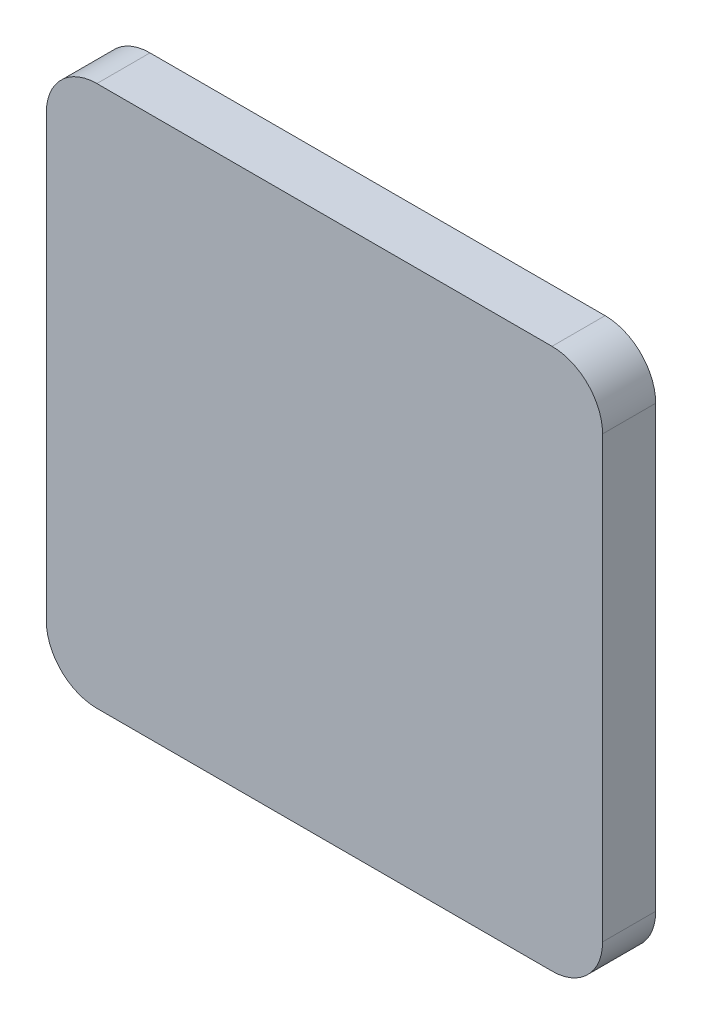
ISO-10303-21;
HEADER;
FILE_DESCRIPTION(('STEP AP214'),'2;1');
FILE_NAME('part.step','',(''),(''),'','','');
FILE_SCHEMA(('AUTOMOTIVE_DESIGN { 1 0 10303 214 1 1 1 1 }'));
ENDSEC;
DATA;
#1=APPLICATION_CONTEXT('core data for automotive mechanical design processes');
#2=APPLICATION_PROTOCOL_DEFINITION('international standard','automotive_design',2000,#1);
#3=PRODUCT_CONTEXT('',#1,'mechanical');
#4=PRODUCT('Part','Part','',(#3));
#5=PRODUCT_RELATED_PRODUCT_CATEGORY('part','',(#4));
#6=PRODUCT_DEFINITION_FORMATION('','',#4);
#7=PRODUCT_DEFINITION_CONTEXT('part definition',#1,'design');
#8=PRODUCT_DEFINITION('design','',#6,#7);
#9=PRODUCT_DEFINITION_SHAPE('','',#8);
#10=(LENGTH_UNIT() NAMED_UNIT(*) SI_UNIT(.MILLI.,.METRE.));
#11=(NAMED_UNIT(*) PLANE_ANGLE_UNIT() SI_UNIT($,.RADIAN.));
#12=(NAMED_UNIT(*) SI_UNIT($,.STERADIAN.) SOLID_ANGLE_UNIT());
#13=UNCERTAINTY_MEASURE_WITH_UNIT(LENGTH_MEASURE(1.E-05),#10,'distance_accuracy_value','');
#14=(GEOMETRIC_REPRESENTATION_CONTEXT(3) GLOBAL_UNCERTAINTY_ASSIGNED_CONTEXT((#13)) GLOBAL_UNIT_ASSIGNED_CONTEXT((#10,
#11,#12)) REPRESENTATION_CONTEXT('',''));
#15=CARTESIAN_POINT('',(0.,0.,0.));
#16=DIRECTION('',(0.,0.,1.));
#17=DIRECTION('',(1.,0.,0.));
#18=AXIS2_PLACEMENT_3D('',#15,#16,#17);
#19=CARTESIAN_POINT('',(8.5,2.5,-20.5854317418897));
#20=DIRECTION('',(0.,0.,-1.));
#21=DIRECTION('',(-1.,0.,0.));
#22=AXIS2_PLACEMENT_3D('',#19,#20,#21);
#23=CYLINDRICAL_SURFACE('',#22,0.5);
#24=DIRECTION('',(0.,0.,1.));
#25=VECTOR('',#24,1.);
#26=CARTESIAN_POINT('',(8.5,2.,2.));
#27=LINE('',#26,#25);
#28=CARTESIAN_POINT('',(8.5,2.,1.6));
#29=VERTEX_POINT('',#28);
#30=CARTESIAN_POINT('',(8.5,2.,0.));
#31=VERTEX_POINT('',#30);
#32=EDGE_CURVE('E344',#29,#31,#27,.F.);
#33=ORIENTED_EDGE('',*,*,#32,.F.);
#34=CARTESIAN_POINT('',(8.5,2.5,1.6));
#35=DIRECTION('',(0.,0.,-1.));
#36=DIRECTION('',(-1.,0.,0.));
#37=AXIS2_PLACEMENT_3D('',#34,#35,#36);
#38=CIRCLE('',#37,0.5);
#39=CARTESIAN_POINT('',(9.,2.5,1.6));
#40=VERTEX_POINT('',#39);
#41=EDGE_CURVE('E238',#40,#29,#38,.T.);
#42=ORIENTED_EDGE('',*,*,#41,.F.);
#43=DIRECTION('',(0.,0.,1.));
#44=VECTOR('',#43,1.);
#45=CARTESIAN_POINT('',(9.,2.5,-20.5854317418897));
#46=LINE('',#45,#44);
#47=CARTESIAN_POINT('',(9.,2.5,0.));
#48=VERTEX_POINT('',#47);
#49=EDGE_CURVE('E237',#48,#40,#46,.T.);
#50=ORIENTED_EDGE('',*,*,#49,.F.);
#51=CARTESIAN_POINT('',(8.5,2.5,0.));
#52=DIRECTION('',(0.,0.,-1.));
#53=DIRECTION('',(-1.,0.,0.));
#54=AXIS2_PLACEMENT_3D('',#51,#52,#53);
#55=CIRCLE('',#54,0.5);
#56=EDGE_CURVE('E19',#31,#48,#55,.F.);
#57=ORIENTED_EDGE('',*,*,#56,.F.);
#58=EDGE_LOOP('',(#33,#42,#50,#57));
#59=FACE_BOUND('',#58,.T.);
#60=ADVANCED_FACE('F16',(#59),#23,.F.);
#61=CARTESIAN_POINT('',(8.5,18.9,2.));
#62=DIRECTION('',(0.,0.,-1.));
#63=DIRECTION('',(-1.,0.,0.));
#64=AXIS2_PLACEMENT_3D('',#61,#62,#63);
#65=CYLINDRICAL_SURFACE('',#64,0.5);
#66=DIRECTION('',(0.,0.,1.));
#67=VECTOR('',#66,1.);
#68=CARTESIAN_POINT('',(9.,18.9,-20.5854317418897));
#69=LINE('',#68,#67);
#70=CARTESIAN_POINT('',(9.,18.9,1.6));
#71=VERTEX_POINT('',#70);
#72=CARTESIAN_POINT('',(9.,18.9,0.));
#73=VERTEX_POINT('',#72);
#74=EDGE_CURVE('E249',#71,#73,#69,.F.);
#75=ORIENTED_EDGE('',*,*,#74,.F.);
#76=CARTESIAN_POINT('',(8.5,18.9,1.6));
#77=DIRECTION('',(0.,0.,-1.));
#78=DIRECTION('',(-1.,0.,0.));
#79=AXIS2_PLACEMENT_3D('',#76,#77,#78);
#80=CIRCLE('',#79,0.5);
#81=CARTESIAN_POINT('',(8.5,19.4,1.6));
#82=VERTEX_POINT('',#81);
#83=EDGE_CURVE('E439',#82,#71,#80,.T.);
#84=ORIENTED_EDGE('',*,*,#83,.F.);
#85=DIRECTION('',(0.,0.,-1.));
#86=VECTOR('',#85,1.);
#87=CARTESIAN_POINT('',(8.5,19.4,2.));
#88=LINE('',#87,#86);
#89=CARTESIAN_POINT('',(8.5,19.4,0.));
#90=VERTEX_POINT('',#89);
#91=EDGE_CURVE('E331',#90,#82,#88,.F.);
#92=ORIENTED_EDGE('',*,*,#91,.F.);
#93=CARTESIAN_POINT('',(8.5,18.9,0.));
#94=DIRECTION('',(0.,0.,-1.));
#95=DIRECTION('',(-1.,0.,0.));
#96=AXIS2_PLACEMENT_3D('',#93,#94,#95);
#97=CIRCLE('',#96,0.5);
#98=EDGE_CURVE('E235',#73,#90,#97,.F.);
#99=ORIENTED_EDGE('',*,*,#98,.F.);
#100=EDGE_LOOP('',(#75,#84,#92,#99));
#101=FACE_BOUND('',#100,.T.);
#102=ADVANCED_FACE('F446',(#101),#65,.F.);
#103=CARTESIAN_POINT('',(19.5,18.9,1.6));
#104=DIRECTION('',(0.,0.,-1.));
#105=DIRECTION('',(-1.,0.,0.));
#106=AXIS2_PLACEMENT_3D('',#103,#104,#105);
#107=PLANE('',#106);
#108=DIRECTION('',(1.,0.,0.));
#109=VECTOR('',#108,1.);
#110=CARTESIAN_POINT('',(2.,19.4,1.6));
#111=LINE('',#110,#109);
#112=CARTESIAN_POINT('',(2.5,19.4,1.6));
#113=VERTEX_POINT('',#112);
#114=EDGE_CURVE('E335',#82,#113,#111,.F.);
#115=ORIENTED_EDGE('',*,*,#114,.F.);
#116=ORIENTED_EDGE('',*,*,#83,.T.);
#117=DIRECTION('',(0.,-1.,0.));
#118=VECTOR('',#117,1.);
#119=CARTESIAN_POINT('',(9.,0.,1.6));
#120=LINE('',#119,#118);
#121=EDGE_CURVE('E243',#40,#71,#120,.F.);
#122=ORIENTED_EDGE('',*,*,#121,.F.);
#123=ORIENTED_EDGE('',*,*,#41,.T.);
#124=DIRECTION('',(1.,0.,0.));
#125=VECTOR('',#124,1.);
#126=CARTESIAN_POINT('',(2.,2.,1.6));
#127=LINE('',#126,#125);
#128=CARTESIAN_POINT('',(2.5,2.,1.6));
#129=VERTEX_POINT('',#128);
#130=EDGE_CURVE('E347',#129,#29,#127,.T.);
#131=ORIENTED_EDGE('',*,*,#130,.F.);
#132=CARTESIAN_POINT('',(2.5,2.5,1.6));
#133=DIRECTION('',(0.,0.,1.));
#134=DIRECTION('',(1.,0.,0.));
#135=AXIS2_PLACEMENT_3D('',#132,#133,#134);
#136=CIRCLE('',#135,0.5);
#137=CARTESIAN_POINT('',(2.,2.5,1.6));
#138=VERTEX_POINT('',#137);
#139=EDGE_CURVE('E433',#129,#138,#136,.F.);
#140=ORIENTED_EDGE('',*,*,#139,.T.);
#141=DIRECTION('',(0.,1.,0.));
#142=VECTOR('',#141,1.);
#143=CARTESIAN_POINT('',(2.,2.,1.6));
#144=LINE('',#143,#142);
#145=CARTESIAN_POINT('',(2.,18.9,1.6));
#146=VERTEX_POINT('',#145);
#147=EDGE_CURVE('E330',#146,#138,#144,.F.);
#148=ORIENTED_EDGE('',*,*,#147,.F.);
#149=CARTESIAN_POINT('',(2.5,18.9,1.6));
#150=DIRECTION('',(0.,0.,1.));
#151=DIRECTION('',(1.,0.,0.));
#152=AXIS2_PLACEMENT_3D('',#149,#150,#151);
#153=CIRCLE('',#152,0.5);
#154=EDGE_CURVE('E427',#146,#113,#153,.F.);
#155=ORIENTED_EDGE('',*,*,#154,.T.);
#156=EDGE_LOOP('',(#115,#116,#122,#123,#131,#140,#148,#155));
#157=FACE_BOUND('',#156,.T.);
#158=ADVANCED_FACE('F534',(#157),#107,.T.);
#159=CARTESIAN_POINT('',(2.5,2.5,2.));
#160=DIRECTION('',(0.,0.,1.));
#161=DIRECTION('',(1.,0.,0.));
#162=AXIS2_PLACEMENT_3D('',#159,#160,#161);
#163=CYLINDRICAL_SURFACE('',#162,0.5);
#164=ORIENTED_EDGE('',*,*,#139,.F.);
#165=DIRECTION('',(0.,0.,1.));
#166=VECTOR('',#165,1.);
#167=CARTESIAN_POINT('',(2.5,2.,2.));
#168=LINE('',#167,#166);
#169=CARTESIAN_POINT('',(2.5,2.,0.));
#170=VERTEX_POINT('',#169);
#171=EDGE_CURVE('E244',#170,#129,#168,.T.);
#172=ORIENTED_EDGE('',*,*,#171,.F.);
#173=CARTESIAN_POINT('',(2.5,2.5,0.));
#174=DIRECTION('',(0.,0.,1.));
#175=DIRECTION('',(1.,0.,0.));
#176=AXIS2_PLACEMENT_3D('',#173,#174,#175);
#177=CIRCLE('',#176,0.5);
#178=CARTESIAN_POINT('',(2.,2.5,0.));
#179=VERTEX_POINT('',#178);
#180=EDGE_CURVE('E436',#179,#170,#177,.T.);
#181=ORIENTED_EDGE('',*,*,#180,.F.);
#182=DIRECTION('',(0.,0.,-1.));
#183=VECTOR('',#182,1.);
#184=CARTESIAN_POINT('',(2.,2.5,2.));
#185=LINE('',#184,#183);
#186=EDGE_CURVE('E326',#138,#179,#185,.T.);
#187=ORIENTED_EDGE('',*,*,#186,.F.);
#188=EDGE_LOOP('',(#164,#172,#181,#187));
#189=FACE_BOUND('',#188,.T.);
#190=ADVANCED_FACE('F747',(#189),#163,.F.);
#191=CARTESIAN_POINT('',(2.5,18.9,2.));
#192=DIRECTION('',(0.,0.,1.));
#193=DIRECTION('',(1.,0.,0.));
#194=AXIS2_PLACEMENT_3D('',#191,#192,#193);
#195=CYLINDRICAL_SURFACE('',#194,0.5);
#196=ORIENTED_EDGE('',*,*,#154,.F.);
#197=DIRECTION('',(0.,0.,-1.));
#198=VECTOR('',#197,1.);
#199=CARTESIAN_POINT('',(2.,18.9,2.));
#200=LINE('',#199,#198);
#201=CARTESIAN_POINT('',(2.,18.9,0.));
#202=VERTEX_POINT('',#201);
#203=EDGE_CURVE('E320',#202,#146,#200,.F.);
#204=ORIENTED_EDGE('',*,*,#203,.F.);
#205=CARTESIAN_POINT('',(2.5,18.9,0.));
#206=DIRECTION('',(0.,0.,1.));
#207=DIRECTION('',(1.,0.,0.));
#208=AXIS2_PLACEMENT_3D('',#205,#206,#207);
#209=CIRCLE('',#208,0.5);
#210=CARTESIAN_POINT('',(2.5,19.4,0.));
#211=VERTEX_POINT('',#210);
#212=EDGE_CURVE('E430',#211,#202,#209,.T.);
#213=ORIENTED_EDGE('',*,*,#212,.F.);
#214=DIRECTION('',(0.,0.,-1.));
#215=VECTOR('',#214,1.);
#216=CARTESIAN_POINT('',(2.5,19.4,2.));
#217=LINE('',#216,#215);
#218=EDGE_CURVE('E336',#113,#211,#217,.T.);
#219=ORIENTED_EDGE('',*,*,#218,.F.);
#220=EDGE_LOOP('',(#196,#204,#213,#219));
#221=FACE_BOUND('',#220,.T.);
#222=ADVANCED_FACE('F453',(#221),#195,.F.);
#223=CARTESIAN_POINT('',(19.5,4.5,2.));
#224=DIRECTION('',(0.,0.,1.));
#225=DIRECTION('',(1.,0.,0.));
#226=AXIS2_PLACEMENT_3D('',#223,#224,#225);
#227=CYLINDRICAL_SURFACE('',#226,0.5);
#228=DIRECTION('',(0.,0.,1.));
#229=VECTOR('',#228,1.);
#230=CARTESIAN_POINT('',(19.5,4.,-20.5854317418897));
#231=LINE('',#230,#229);
#232=CARTESIAN_POINT('',(19.5,4.,0.));
#233=VERTEX_POINT('',#232);
#234=CARTESIAN_POINT('',(19.5,4.,1.6));
#235=VERTEX_POINT('',#234);
#236=EDGE_CURVE('E319',#233,#235,#231,.T.);
#237=ORIENTED_EDGE('',*,*,#236,.T.);
#238=CARTESIAN_POINT('',(19.5,4.5,1.6));
#239=DIRECTION('',(0.,0.,1.));
#240=DIRECTION('',(1.,0.,0.));
#241=AXIS2_PLACEMENT_3D('',#238,#239,#240);
#242=CIRCLE('',#241,0.5);
#243=CARTESIAN_POINT('',(20.,4.5,1.6));
#244=VERTEX_POINT('',#243);
#245=EDGE_CURVE('E411',#244,#235,#242,.F.);
#246=ORIENTED_EDGE('',*,*,#245,.F.);
#247=DIRECTION('',(0.,0.,1.));
#248=VECTOR('',#247,1.);
#249=CARTESIAN_POINT('',(20.,4.5,2.));
#250=LINE('',#249,#248);
#251=CARTESIAN_POINT('',(20.,4.5,0.));
#252=VERTEX_POINT('',#251);
#253=EDGE_CURVE('E305',#252,#244,#250,.T.);
#254=ORIENTED_EDGE('',*,*,#253,.F.);
#255=CARTESIAN_POINT('',(19.5,4.5,0.));
#256=DIRECTION('',(0.,0.,1.));
#257=DIRECTION('',(1.,0.,0.));
#258=AXIS2_PLACEMENT_3D('',#255,#256,#257);
#259=CIRCLE('',#258,0.5);
#260=EDGE_CURVE('E424',#233,#252,#259,.T.);
#261=ORIENTED_EDGE('',*,*,#260,.F.);
#262=EDGE_LOOP('',(#237,#246,#254,#261));
#263=FACE_BOUND('',#262,.T.);
#264=ADVANCED_FACE('F730',(#263),#227,.F.);
#265=CARTESIAN_POINT('',(19.5,16.9,-20.5854317418897));
#266=DIRECTION('',(0.,0.,-1.));
#267=DIRECTION('',(-1.,0.,0.));
#268=AXIS2_PLACEMENT_3D('',#265,#266,#267);
#269=CYLINDRICAL_SURFACE('',#268,0.5);
#270=DIRECTION('',(0.,0.,1.));
#271=VECTOR('',#270,1.);
#272=CARTESIAN_POINT('',(20.,16.9,2.));
#273=LINE('',#272,#271);
#274=CARTESIAN_POINT('',(20.,16.9,1.6));
#275=VERTEX_POINT('',#274);
#276=CARTESIAN_POINT('',(20.,16.9,0.));
#277=VERTEX_POINT('',#276);
#278=EDGE_CURVE('E311',#275,#277,#273,.F.);
#279=ORIENTED_EDGE('',*,*,#278,.F.);
#280=CARTESIAN_POINT('',(19.5,16.9,1.6));
#281=DIRECTION('',(0.,0.,-1.));
#282=DIRECTION('',(-1.,0.,0.));
#283=AXIS2_PLACEMENT_3D('',#280,#281,#282);
#284=CIRCLE('',#283,0.5);
#285=CARTESIAN_POINT('',(19.5,17.4,1.6));
#286=VERTEX_POINT('',#285);
#287=EDGE_CURVE('E371',#286,#275,#284,.T.);
#288=ORIENTED_EDGE('',*,*,#287,.F.);
#289=DIRECTION('',(0.,0.,-1.));
#290=VECTOR('',#289,1.);
#291=CARTESIAN_POINT('',(19.5,17.4,-20.5854317418897));
#292=LINE('',#291,#290);
#293=CARTESIAN_POINT('',(19.5,17.4,0.));
#294=VERTEX_POINT('',#293);
#295=EDGE_CURVE('E294',#294,#286,#292,.F.);
#296=ORIENTED_EDGE('',*,*,#295,.F.);
#297=CARTESIAN_POINT('',(19.5,16.9,0.));
#298=DIRECTION('',(0.,0.,-1.));
#299=DIRECTION('',(-1.,0.,0.));
#300=AXIS2_PLACEMENT_3D('',#297,#298,#299);
#301=CIRCLE('',#300,0.5);
#302=EDGE_CURVE('E421',#277,#294,#301,.F.);
#303=ORIENTED_EDGE('',*,*,#302,.F.);
#304=EDGE_LOOP('',(#279,#288,#296,#303));
#305=FACE_BOUND('',#304,.T.);
#306=ADVANCED_FACE('F721',(#305),#269,.F.);
#307=CARTESIAN_POINT('',(13.5,16.9,-20.5854317418897));
#308=DIRECTION('',(0.,0.,1.));
#309=DIRECTION('',(1.,0.,0.));
#310=AXIS2_PLACEMENT_3D('',#307,#308,#309);
#311=CYLINDRICAL_SURFACE('',#310,0.5);
#312=DIRECTION('',(0.,0.,-1.));
#313=VECTOR('',#312,1.);
#314=CARTESIAN_POINT('',(13.5,17.4,-20.5854317418897));
#315=LINE('',#314,#313);
#316=CARTESIAN_POINT('',(13.5,17.4,1.6));
#317=VERTEX_POINT('',#316);
#318=CARTESIAN_POINT('',(13.5,17.4,0.));
#319=VERTEX_POINT('',#318);
#320=EDGE_CURVE('E300',#317,#319,#315,.T.);
#321=ORIENTED_EDGE('',*,*,#320,.F.);
#322=CARTESIAN_POINT('',(13.5,16.9,1.6));
#323=DIRECTION('',(0.,0.,1.));
#324=DIRECTION('',(1.,0.,0.));
#325=AXIS2_PLACEMENT_3D('',#322,#323,#324);
#326=CIRCLE('',#325,0.5);
#327=CARTESIAN_POINT('',(13.,16.9,1.6));
#328=VERTEX_POINT('',#327);
#329=EDGE_CURVE('E404',#328,#317,#326,.F.);
#330=ORIENTED_EDGE('',*,*,#329,.F.);
#331=DIRECTION('',(0.,0.,1.));
#332=VECTOR('',#331,1.);
#333=CARTESIAN_POINT('',(13.,16.9,-20.5854317418897));
#334=LINE('',#333,#332);
#335=CARTESIAN_POINT('',(13.,16.9,0.));
#336=VERTEX_POINT('',#335);
#337=EDGE_CURVE('E289',#328,#336,#334,.F.);
#338=ORIENTED_EDGE('',*,*,#337,.T.);
#339=CARTESIAN_POINT('',(13.5,16.9,0.));
#340=DIRECTION('',(0.,0.,1.));
#341=DIRECTION('',(1.,0.,0.));
#342=AXIS2_PLACEMENT_3D('',#339,#340,#341);
#343=CIRCLE('',#342,0.5);
#344=EDGE_CURVE('E418',#319,#336,#343,.T.);
#345=ORIENTED_EDGE('',*,*,#344,.F.);
#346=EDGE_LOOP('',(#321,#330,#338,#345));
#347=FACE_BOUND('',#346,.T.);
#348=ADVANCED_FACE('F712',(#347),#311,.F.);
#349=CARTESIAN_POINT('',(13.5,4.5,-20.5854317418897));
#350=DIRECTION('',(0.,0.,-1.));
#351=DIRECTION('',(-1.,0.,0.));
#352=AXIS2_PLACEMENT_3D('',#349,#350,#351);
#353=CYLINDRICAL_SURFACE('',#352,0.5);
#354=DIRECTION('',(0.,0.,1.));
#355=VECTOR('',#354,1.);
#356=CARTESIAN_POINT('',(13.,4.5,-20.5854317418897));
#357=LINE('',#356,#355);
#358=CARTESIAN_POINT('',(13.,4.5,0.));
#359=VERTEX_POINT('',#358);
#360=CARTESIAN_POINT('',(13.,4.5,1.6));
#361=VERTEX_POINT('',#360);
#362=EDGE_CURVE('E293',#359,#361,#357,.T.);
#363=ORIENTED_EDGE('',*,*,#362,.T.);
#364=CARTESIAN_POINT('',(13.5,4.5,1.6));
#365=DIRECTION('',(0.,0.,-1.));
#366=DIRECTION('',(-1.,0.,0.));
#367=AXIS2_PLACEMENT_3D('',#364,#365,#366);
#368=CIRCLE('',#367,0.5);
#369=CARTESIAN_POINT('',(13.5,4.,1.6));
#370=VERTEX_POINT('',#369);
#371=EDGE_CURVE('E407',#370,#361,#368,.T.);
#372=ORIENTED_EDGE('',*,*,#371,.F.);
#373=DIRECTION('',(0.,0.,1.));
#374=VECTOR('',#373,1.);
#375=CARTESIAN_POINT('',(13.5,4.,-20.5854317418897));
#376=LINE('',#375,#374);
#377=CARTESIAN_POINT('',(13.5,4.,0.));
#378=VERTEX_POINT('',#377);
#379=EDGE_CURVE('E315',#370,#378,#376,.F.);
#380=ORIENTED_EDGE('',*,*,#379,.T.);
#381=CARTESIAN_POINT('',(13.5,4.5,0.));
#382=DIRECTION('',(0.,0.,-1.));
#383=DIRECTION('',(-1.,0.,0.));
#384=AXIS2_PLACEMENT_3D('',#381,#382,#383);
#385=CIRCLE('',#384,0.5);
#386=EDGE_CURVE('E415',#359,#378,#385,.F.);
#387=ORIENTED_EDGE('',*,*,#386,.F.);
#388=EDGE_LOOP('',(#363,#372,#380,#387));
#389=FACE_BOUND('',#388,.T.);
#390=ADVANCED_FACE('F552',(#389),#353,.F.);
#391=CARTESIAN_POINT('',(19.5,18.9,1.6));
#392=DIRECTION('',(0.,0.,-1.));
#393=DIRECTION('',(-1.,0.,0.));
#394=AXIS2_PLACEMENT_3D('',#391,#392,#393);
#395=PLANE('',#394);
#396=DIRECTION('',(1.,0.,0.));
#397=VECTOR('',#396,1.);
#398=CARTESIAN_POINT('',(0.,17.4,1.6));
#399=LINE('',#398,#397);
#400=EDGE_CURVE('E304',#286,#317,#399,.F.);
#401=ORIENTED_EDGE('',*,*,#400,.F.);
#402=ORIENTED_EDGE('',*,*,#287,.T.);
#403=DIRECTION('',(0.,1.,0.));
#404=VECTOR('',#403,1.);
#405=CARTESIAN_POINT('',(20.,2.,1.6));
#406=LINE('',#405,#404);
#407=EDGE_CURVE('E309',#244,#275,#406,.T.);
#408=ORIENTED_EDGE('',*,*,#407,.F.);
#409=ORIENTED_EDGE('',*,*,#245,.T.);
#410=DIRECTION('',(1.,0.,0.));
#411=VECTOR('',#410,1.);
#412=CARTESIAN_POINT('',(0.,4.,1.6));
#413=LINE('',#412,#411);
#414=EDGE_CURVE('E310',#235,#370,#413,.F.);
#415=ORIENTED_EDGE('',*,*,#414,.T.);
#416=ORIENTED_EDGE('',*,*,#371,.T.);
#417=DIRECTION('',(0.,-1.,0.));
#418=VECTOR('',#417,1.);
#419=CARTESIAN_POINT('',(13.,0.,1.6));
#420=LINE('',#419,#418);
#421=EDGE_CURVE('E261',#361,#328,#420,.F.);
#422=ORIENTED_EDGE('',*,*,#421,.T.);
#423=ORIENTED_EDGE('',*,*,#329,.T.);
#424=EDGE_LOOP('',(#401,#402,#408,#409,#415,#416,#422,#423));
#425=FACE_BOUND('',#424,.T.);
#426=ADVANCED_FACE('F548',(#425),#395,.T.);
#427=CARTESIAN_POINT('',(2.,2.,2.));
#428=DIRECTION('',(0.,1.,0.));
#429=DIRECTION('',(0.,0.,1.));
#430=AXIS2_PLACEMENT_3D('',#427,#428,#429);
#431=PLANE('',#430);
#432=DIRECTION('',(-1.,0.,0.));
#433=VECTOR('',#432,1.);
#434=CARTESIAN_POINT('',(20.,2.,0.));
#435=LINE('',#434,#433);
#436=EDGE_CURVE('E233',#170,#31,#435,.F.);
#437=ORIENTED_EDGE('',*,*,#436,.F.);
#438=ORIENTED_EDGE('',*,*,#171,.T.);
#439=ORIENTED_EDGE('',*,*,#130,.T.);
#440=ORIENTED_EDGE('',*,*,#32,.T.);
#441=EDGE_LOOP('',(#437,#438,#439,#440));
#442=FACE_BOUND('',#441,.T.);
#443=ADVANCED_FACE('F551',(#442),#431,.T.);
#444=CARTESIAN_POINT('',(9.,0.,-20.5854317418897));
#445=DIRECTION('',(-1.,0.,0.));
#446=DIRECTION('',(0.,-1.,0.));
#447=AXIS2_PLACEMENT_3D('',#444,#445,#446);
#448=PLANE('',#447);
#449=ORIENTED_EDGE('',*,*,#121,.T.);
#450=ORIENTED_EDGE('',*,*,#74,.T.);
#451=DIRECTION('',(0.,1.,0.));
#452=VECTOR('',#451,1.);
#453=CARTESIAN_POINT('',(9.,19.4,0.));
#454=LINE('',#453,#452);
#455=EDGE_CURVE('E231',#48,#73,#454,.T.);
#456=ORIENTED_EDGE('',*,*,#455,.F.);
#457=ORIENTED_EDGE('',*,*,#49,.T.);
#458=EDGE_LOOP('',(#449,#450,#456,#457));
#459=FACE_BOUND('',#458,.T.);
#460=ADVANCED_FACE('F247',(#459),#448,.T.);
#461=CARTESIAN_POINT('',(2.,19.4,2.));
#462=DIRECTION('',(0.,-1.,0.));
#463=DIRECTION('',(0.,0.,-1.));
#464=AXIS2_PLACEMENT_3D('',#461,#462,#463);
#465=PLANE('',#464);
#466=ORIENTED_EDGE('',*,*,#114,.T.);
#467=ORIENTED_EDGE('',*,*,#218,.T.);
#468=DIRECTION('',(-1.,0.,0.));
#469=VECTOR('',#468,1.);
#470=CARTESIAN_POINT('',(20.,19.4,0.));
#471=LINE('',#470,#469);
#472=EDGE_CURVE('E251',#90,#211,#471,.T.);
#473=ORIENTED_EDGE('',*,*,#472,.F.);
#474=ORIENTED_EDGE('',*,*,#91,.T.);
#475=EDGE_LOOP('',(#466,#467,#473,#474));
#476=FACE_BOUND('',#475,.T.);
#477=ADVANCED_FACE('F449',(#476),#465,.T.);
#478=CARTESIAN_POINT('',(2.,2.,2.));
#479=DIRECTION('',(1.,0.,0.));
#480=DIRECTION('',(0.,0.,-1.));
#481=AXIS2_PLACEMENT_3D('',#478,#479,#480);
#482=PLANE('',#481);
#483=DIRECTION('',(0.,1.,0.));
#484=VECTOR('',#483,1.);
#485=CARTESIAN_POINT('',(2.,19.4,0.));
#486=LINE('',#485,#484);
#487=EDGE_CURVE('E258',#202,#179,#486,.F.);
#488=ORIENTED_EDGE('',*,*,#487,.F.);
#489=ORIENTED_EDGE('',*,*,#203,.T.);
#490=ORIENTED_EDGE('',*,*,#147,.T.);
#491=ORIENTED_EDGE('',*,*,#186,.T.);
#492=EDGE_LOOP('',(#488,#489,#490,#491));
#493=FACE_BOUND('',#492,.T.);
#494=ADVANCED_FACE('F672',(#493),#482,.T.);
#495=CARTESIAN_POINT('',(0.,4.,-20.5854317418897));
#496=DIRECTION('',(0.,-1.,0.));
#497=DIRECTION('',(1.,0.,0.));
#498=AXIS2_PLACEMENT_3D('',#495,#496,#497);
#499=PLANE('',#498);
#500=ORIENTED_EDGE('',*,*,#236,.F.);
#501=DIRECTION('',(-1.,0.,0.));
#502=VECTOR('',#501,1.);
#503=CARTESIAN_POINT('',(20.,4.,0.));
#504=LINE('',#503,#502);
#505=EDGE_CURVE('E459',#378,#233,#504,.F.);
#506=ORIENTED_EDGE('',*,*,#505,.F.);
#507=ORIENTED_EDGE('',*,*,#379,.F.);
#508=ORIENTED_EDGE('',*,*,#414,.F.);
#509=EDGE_LOOP('',(#500,#506,#507,#508));
#510=FACE_BOUND('',#509,.T.);
#511=ADVANCED_FACE('F541',(#510),#499,.F.);
#512=CARTESIAN_POINT('',(20.,2.,2.));
#513=DIRECTION('',(-1.,0.,0.));
#514=DIRECTION('',(0.,0.,1.));
#515=AXIS2_PLACEMENT_3D('',#512,#513,#514);
#516=PLANE('',#515);
#517=ORIENTED_EDGE('',*,*,#407,.T.);
#518=ORIENTED_EDGE('',*,*,#278,.T.);
#519=DIRECTION('',(0.,1.,0.));
#520=VECTOR('',#519,1.);
#521=CARTESIAN_POINT('',(20.,19.4,0.));
#522=LINE('',#521,#520);
#523=EDGE_CURVE('E462',#252,#277,#522,.T.);
#524=ORIENTED_EDGE('',*,*,#523,.F.);
#525=ORIENTED_EDGE('',*,*,#253,.T.);
#526=EDGE_LOOP('',(#517,#518,#524,#525));
#527=FACE_BOUND('',#526,.T.);
#528=ADVANCED_FACE('F537',(#527),#516,.T.);
#529=CARTESIAN_POINT('',(0.,17.4,-20.5854317418897));
#530=DIRECTION('',(0.,-1.,0.));
#531=DIRECTION('',(0.,0.,-1.));
#532=AXIS2_PLACEMENT_3D('',#529,#530,#531);
#533=PLANE('',#532);
#534=DIRECTION('',(-1.,0.,0.));
#535=VECTOR('',#534,1.);
#536=CARTESIAN_POINT('',(20.,17.4,0.));
#537=LINE('',#536,#535);
#538=EDGE_CURVE('E468',#294,#319,#537,.T.);
#539=ORIENTED_EDGE('',*,*,#538,.F.);
#540=ORIENTED_EDGE('',*,*,#295,.T.);
#541=ORIENTED_EDGE('',*,*,#400,.T.);
#542=ORIENTED_EDGE('',*,*,#320,.T.);
#543=EDGE_LOOP('',(#539,#540,#541,#542));
#544=FACE_BOUND('',#543,.T.);
#545=ADVANCED_FACE('F540',(#544),#533,.T.);
#546=CARTESIAN_POINT('',(13.,0.,-20.5854317418897));
#547=DIRECTION('',(-1.,0.,0.));
#548=DIRECTION('',(0.,-1.,0.));
#549=AXIS2_PLACEMENT_3D('',#546,#547,#548);
#550=PLANE('',#549);
#551=ORIENTED_EDGE('',*,*,#362,.F.);
#552=DIRECTION('',(0.,1.,0.));
#553=VECTOR('',#552,1.);
#554=CARTESIAN_POINT('',(13.,19.4,0.));
#555=LINE('',#554,#553);
#556=EDGE_CURVE('E401',#336,#359,#555,.F.);
#557=ORIENTED_EDGE('',*,*,#556,.F.);
#558=ORIENTED_EDGE('',*,*,#337,.F.);
#559=ORIENTED_EDGE('',*,*,#421,.F.);
#560=EDGE_LOOP('',(#551,#557,#558,#559));
#561=FACE_BOUND('',#560,.T.);
#562=ADVANCED_FACE('F559',(#561),#550,.F.);
#563=CARTESIAN_POINT('',(20.,19.4,0.));
#564=DIRECTION('',(0.,0.,-1.));
#565=DIRECTION('',(-1.,0.,0.));
#566=AXIS2_PLACEMENT_3D('',#563,#564,#565);
#567=PLANE('',#566);
#568=CARTESIAN_POINT('',(2.,19.4,0.));
#569=DIRECTION('',(0.,0.,-1.));
#570=DIRECTION('',(-1.,0.,0.));
#571=AXIS2_PLACEMENT_3D('',#568,#569,#570);
#572=CIRCLE('',#571,2.);
#573=CARTESIAN_POINT('',(2.,21.4,0.));
#574=VERTEX_POINT('',#573);
#575=CARTESIAN_POINT('',(0.,19.4,0.));
#576=VERTEX_POINT('',#575);
#577=EDGE_CURVE('E287',#574,#576,#572,.F.);
#578=ORIENTED_EDGE('',*,*,#577,.F.);
#579=DIRECTION('',(1.,0.,0.));
#580=VECTOR('',#579,1.);
#581=CARTESIAN_POINT('',(2.,21.4,0.));
#582=LINE('',#581,#580);
#583=CARTESIAN_POINT('',(20.,21.4,0.));
#584=VERTEX_POINT('',#583);
#585=EDGE_CURVE('E283',#574,#584,#582,.T.);
#586=ORIENTED_EDGE('',*,*,#585,.T.);
#587=CARTESIAN_POINT('',(20.,19.4,0.));
#588=DIRECTION('',(0.,0.,-1.));
#589=DIRECTION('',(-1.,0.,0.));
#590=AXIS2_PLACEMENT_3D('',#587,#588,#589);
#591=CIRCLE('',#590,2.);
#592=CARTESIAN_POINT('',(22.,19.4,0.));
#593=VERTEX_POINT('',#592);
#594=EDGE_CURVE('E398',#593,#584,#591,.F.);
#595=ORIENTED_EDGE('',*,*,#594,.F.);
#596=DIRECTION('',(0.,1.,0.));
#597=VECTOR('',#596,1.);
#598=CARTESIAN_POINT('',(22.,2.,0.));
#599=LINE('',#598,#597);
#600=CARTESIAN_POINT('',(22.,2.,0.));
#601=VERTEX_POINT('',#600);
#602=EDGE_CURVE('E265',#593,#601,#599,.F.);
#603=ORIENTED_EDGE('',*,*,#602,.T.);
#604=CARTESIAN_POINT('',(20.,2.,0.));
#605=DIRECTION('',(0.,0.,-1.));
#606=DIRECTION('',(-1.,0.,0.));
#607=AXIS2_PLACEMENT_3D('',#604,#605,#606);
#608=CIRCLE('',#607,2.);
#609=CARTESIAN_POINT('',(20.,0.,0.));
#610=VERTEX_POINT('',#609);
#611=EDGE_CURVE('E275',#610,#601,#608,.F.);
#612=ORIENTED_EDGE('',*,*,#611,.F.);
#613=DIRECTION('',(1.,0.,0.));
#614=VECTOR('',#613,1.);
#615=CARTESIAN_POINT('',(2.,0.,0.));
#616=LINE('',#615,#614);
#617=CARTESIAN_POINT('',(2.,0.,0.));
#618=VERTEX_POINT('',#617);
#619=EDGE_CURVE('E271',#610,#618,#616,.F.);
#620=ORIENTED_EDGE('',*,*,#619,.T.);
#621=CARTESIAN_POINT('',(2.,2.,0.));
#622=DIRECTION('',(0.,0.,-1.));
#623=DIRECTION('',(-1.,0.,0.));
#624=AXIS2_PLACEMENT_3D('',#621,#622,#623);
#625=CIRCLE('',#624,2.);
#626=CARTESIAN_POINT('',(0.,2.,0.));
#627=VERTEX_POINT('',#626);
#628=EDGE_CURVE('E281',#627,#618,#625,.F.);
#629=ORIENTED_EDGE('',*,*,#628,.F.);
#630=DIRECTION('',(0.,1.,0.));
#631=VECTOR('',#630,1.);
#632=CARTESIAN_POINT('',(0.,2.,0.));
#633=LINE('',#632,#631);
#634=EDGE_CURVE('E277',#627,#576,#633,.T.);
#635=ORIENTED_EDGE('',*,*,#634,.T.);
#636=EDGE_LOOP('',(#578,#586,#595,#603,#612,#620,#629,#635));
#637=FACE_BOUND('',#636,.T.);
#638=ORIENTED_EDGE('',*,*,#556,.T.);
#639=ORIENTED_EDGE('',*,*,#386,.T.);
#640=ORIENTED_EDGE('',*,*,#505,.T.);
#641=ORIENTED_EDGE('',*,*,#260,.T.);
#642=ORIENTED_EDGE('',*,*,#523,.T.);
#643=ORIENTED_EDGE('',*,*,#302,.T.);
#644=ORIENTED_EDGE('',*,*,#538,.T.);
#645=ORIENTED_EDGE('',*,*,#344,.T.);
#646=EDGE_LOOP('',(#638,#639,#640,#641,#642,#643,#644,#645));
#647=FACE_BOUND('',#646,.T.);
#648=ORIENTED_EDGE('',*,*,#487,.T.);
#649=ORIENTED_EDGE('',*,*,#180,.T.);
#650=ORIENTED_EDGE('',*,*,#436,.T.);
#651=ORIENTED_EDGE('',*,*,#56,.T.);
#652=ORIENTED_EDGE('',*,*,#455,.T.);
#653=ORIENTED_EDGE('',*,*,#98,.T.);
#654=ORIENTED_EDGE('',*,*,#472,.T.);
#655=ORIENTED_EDGE('',*,*,#212,.T.);
#656=EDGE_LOOP('',(#648,#649,#650,#651,#652,#653,#654,#655));
#657=FACE_BOUND('',#656,.T.);
#658=ADVANCED_FACE('F229',(#637,#647,#657),#567,.T.);
#659=CARTESIAN_POINT('',(20.,19.4,2.));
#660=DIRECTION('',(0.,0.,-1.));
#661=DIRECTION('',(-1.,0.,0.));
#662=AXIS2_PLACEMENT_3D('',#659,#660,#661);
#663=CYLINDRICAL_SURFACE('',#662,2.);
#664=CARTESIAN_POINT('',(20.,19.4,2.1));
#665=DIRECTION('',(0.,0.,-1.));
#666=DIRECTION('',(-1.,0.,0.));
#667=AXIS2_PLACEMENT_3D('',#664,#665,#666);
#668=CIRCLE('',#667,2.);
#669=CARTESIAN_POINT('',(22.,19.4,2.1));
#670=VERTEX_POINT('',#669);
#671=CARTESIAN_POINT('',(20.,21.4,2.1));
#672=VERTEX_POINT('',#671);
#673=EDGE_CURVE('E269',#670,#672,#668,.F.);
#674=ORIENTED_EDGE('',*,*,#673,.F.);
#675=DIRECTION('',(0.,0.,1.));
#676=VECTOR('',#675,1.);
#677=CARTESIAN_POINT('',(22.,19.4,2.));
#678=LINE('',#677,#676);
#679=EDGE_CURVE('E270',#670,#593,#678,.F.);
#680=ORIENTED_EDGE('',*,*,#679,.T.);
#681=ORIENTED_EDGE('',*,*,#594,.T.);
#682=DIRECTION('',(0.,0.,-1.));
#683=VECTOR('',#682,1.);
#684=CARTESIAN_POINT('',(20.,21.4,2.));
#685=LINE('',#684,#683);
#686=EDGE_CURVE('E288',#584,#672,#685,.F.);
#687=ORIENTED_EDGE('',*,*,#686,.T.);
#688=EDGE_LOOP('',(#674,#680,#681,#687));
#689=FACE_BOUND('',#688,.T.);
#690=ADVANCED_FACE('F576',(#689),#663,.T.);
#691=CARTESIAN_POINT('',(2.,21.4,2.));
#692=DIRECTION('',(0.,-1.,0.));
#693=DIRECTION('',(0.,0.,-1.));
#694=AXIS2_PLACEMENT_3D('',#691,#692,#693);
#695=PLANE('',#694);
#696=DIRECTION('',(0.,0.,-1.));
#697=VECTOR('',#696,1.);
#698=CARTESIAN_POINT('',(2.,21.4,2.));
#699=LINE('',#698,#697);
#700=CARTESIAN_POINT('',(2.,21.4,2.1));
#701=VERTEX_POINT('',#700);
#702=EDGE_CURVE('E397',#701,#574,#699,.T.);
#703=ORIENTED_EDGE('',*,*,#702,.F.);
#704=DIRECTION('',(1.,0.,0.));
#705=VECTOR('',#704,1.);
#706=CARTESIAN_POINT('',(20.,21.4,2.1));
#707=LINE('',#706,#705);
#708=EDGE_CURVE('E385',#672,#701,#707,.F.);
#709=ORIENTED_EDGE('',*,*,#708,.F.);
#710=ORIENTED_EDGE('',*,*,#686,.F.);
#711=ORIENTED_EDGE('',*,*,#585,.F.);
#712=EDGE_LOOP('',(#703,#709,#710,#711));
#713=FACE_BOUND('',#712,.T.);
#714=ADVANCED_FACE('F584',(#713),#695,.F.);
#715=CARTESIAN_POINT('',(2.,19.4,2.));
#716=DIRECTION('',(0.,0.,-1.));
#717=DIRECTION('',(-1.,0.,0.));
#718=AXIS2_PLACEMENT_3D('',#715,#716,#717);
#719=CYLINDRICAL_SURFACE('',#718,2.);
#720=CARTESIAN_POINT('',(2.,19.4,2.1));
#721=DIRECTION('',(0.,0.,-1.));
#722=DIRECTION('',(-1.,0.,0.));
#723=AXIS2_PLACEMENT_3D('',#720,#721,#722);
#724=CIRCLE('',#723,2.);
#725=CARTESIAN_POINT('',(0.,19.4,2.1));
#726=VERTEX_POINT('',#725);
#727=EDGE_CURVE('E381',#701,#726,#724,.F.);
#728=ORIENTED_EDGE('',*,*,#727,.F.);
#729=ORIENTED_EDGE('',*,*,#702,.T.);
#730=ORIENTED_EDGE('',*,*,#577,.T.);
#731=DIRECTION('',(0.,0.,-1.));
#732=VECTOR('',#731,1.);
#733=CARTESIAN_POINT('',(0.,19.4,2.));
#734=LINE('',#733,#732);
#735=EDGE_CURVE('E282',#576,#726,#734,.F.);
#736=ORIENTED_EDGE('',*,*,#735,.T.);
#737=EDGE_LOOP('',(#728,#729,#730,#736));
#738=FACE_BOUND('',#737,.T.);
#739=ADVANCED_FACE('F592',(#738),#719,.T.);
#740=CARTESIAN_POINT('',(0.,2.,2.));
#741=DIRECTION('',(1.,0.,0.));
#742=DIRECTION('',(0.,0.,-1.));
#743=AXIS2_PLACEMENT_3D('',#740,#741,#742);
#744=PLANE('',#743);
#745=DIRECTION('',(0.,0.,-1.));
#746=VECTOR('',#745,1.);
#747=CARTESIAN_POINT('',(0.,2.,2.));
#748=LINE('',#747,#746);
#749=CARTESIAN_POINT('',(0.,2.,2.1));
#750=VERTEX_POINT('',#749);
#751=EDGE_CURVE('E394',#750,#627,#748,.T.);
#752=ORIENTED_EDGE('',*,*,#751,.F.);
#753=DIRECTION('',(0.,1.,0.));
#754=VECTOR('',#753,1.);
#755=CARTESIAN_POINT('',(0.,19.4,2.1));
#756=LINE('',#755,#754);
#757=EDGE_CURVE('E380',#726,#750,#756,.F.);
#758=ORIENTED_EDGE('',*,*,#757,.F.);
#759=ORIENTED_EDGE('',*,*,#735,.F.);
#760=ORIENTED_EDGE('',*,*,#634,.F.);
#761=EDGE_LOOP('',(#752,#758,#759,#760));
#762=FACE_BOUND('',#761,.T.);
#763=ADVANCED_FACE('F600',(#762),#744,.F.);
#764=CARTESIAN_POINT('',(2.,2.,2.));
#765=DIRECTION('',(0.,0.,-1.));
#766=DIRECTION('',(-1.,0.,0.));
#767=AXIS2_PLACEMENT_3D('',#764,#765,#766);
#768=CYLINDRICAL_SURFACE('',#767,2.);
#769=CARTESIAN_POINT('',(2.,2.,2.1));
#770=DIRECTION('',(0.,0.,-1.));
#771=DIRECTION('',(-1.,0.,0.));
#772=AXIS2_PLACEMENT_3D('',#769,#770,#771);
#773=CIRCLE('',#772,2.);
#774=CARTESIAN_POINT('',(2.,0.,2.1));
#775=VERTEX_POINT('',#774);
#776=EDGE_CURVE('E376',#750,#775,#773,.F.);
#777=ORIENTED_EDGE('',*,*,#776,.F.);
#778=ORIENTED_EDGE('',*,*,#751,.T.);
#779=ORIENTED_EDGE('',*,*,#628,.T.);
#780=DIRECTION('',(0.,0.,1.));
#781=VECTOR('',#780,1.);
#782=CARTESIAN_POINT('',(2.,0.,2.));
#783=LINE('',#782,#781);
#784=EDGE_CURVE('E276',#618,#775,#783,.T.);
#785=ORIENTED_EDGE('',*,*,#784,.T.);
#786=EDGE_LOOP('',(#777,#778,#779,#785));
#787=FACE_BOUND('',#786,.T.);
#788=ADVANCED_FACE('F522',(#787),#768,.T.);
#789=CARTESIAN_POINT('',(2.,0.,2.));
#790=DIRECTION('',(0.,1.,0.));
#791=DIRECTION('',(0.,0.,1.));
#792=AXIS2_PLACEMENT_3D('',#789,#790,#791);
#793=PLANE('',#792);
#794=DIRECTION('',(0.,0.,-1.));
#795=VECTOR('',#794,1.);
#796=CARTESIAN_POINT('',(20.,0.,2.));
#797=LINE('',#796,#795);
#798=CARTESIAN_POINT('',(20.,0.,2.1));
#799=VERTEX_POINT('',#798);
#800=EDGE_CURVE('E391',#799,#610,#797,.T.);
#801=ORIENTED_EDGE('',*,*,#800,.F.);
#802=DIRECTION('',(1.,0.,0.));
#803=VECTOR('',#802,1.);
#804=CARTESIAN_POINT('',(20.,0.,2.1));
#805=LINE('',#804,#803);
#806=EDGE_CURVE('E375',#775,#799,#805,.T.);
#807=ORIENTED_EDGE('',*,*,#806,.F.);
#808=ORIENTED_EDGE('',*,*,#784,.F.);
#809=ORIENTED_EDGE('',*,*,#619,.F.);
#810=EDGE_LOOP('',(#801,#807,#808,#809));
#811=FACE_BOUND('',#810,.T.);
#812=ADVANCED_FACE('F509',(#811),#793,.F.);
#813=CARTESIAN_POINT('',(20.,2.,2.));
#814=DIRECTION('',(0.,0.,-1.));
#815=DIRECTION('',(-1.,0.,0.));
#816=AXIS2_PLACEMENT_3D('',#813,#814,#815);
#817=CYLINDRICAL_SURFACE('',#816,2.);
#818=CARTESIAN_POINT('',(20.,2.,2.1));
#819=DIRECTION('',(0.,0.,-1.));
#820=DIRECTION('',(-1.,0.,0.));
#821=AXIS2_PLACEMENT_3D('',#818,#819,#820);
#822=CIRCLE('',#821,2.);
#823=CARTESIAN_POINT('',(22.,2.,2.1));
#824=VERTEX_POINT('',#823);
#825=EDGE_CURVE('E26',#799,#824,#822,.F.);
#826=ORIENTED_EDGE('',*,*,#825,.F.);
#827=ORIENTED_EDGE('',*,*,#800,.T.);
#828=ORIENTED_EDGE('',*,*,#611,.T.);
#829=DIRECTION('',(0.,0.,1.));
#830=VECTOR('',#829,1.);
#831=CARTESIAN_POINT('',(22.,2.,2.));
#832=LINE('',#831,#830);
#833=EDGE_CURVE('E39',#601,#824,#832,.T.);
#834=ORIENTED_EDGE('',*,*,#833,.T.);
#835=EDGE_LOOP('',(#826,#827,#828,#834));
#836=FACE_BOUND('',#835,.T.);
#837=ADVANCED_FACE('F511',(#836),#817,.T.);
#838=CARTESIAN_POINT('',(22.,2.,2.));
#839=DIRECTION('',(-1.,0.,0.));
#840=DIRECTION('',(0.,0.,1.));
#841=AXIS2_PLACEMENT_3D('',#838,#839,#840);
#842=PLANE('',#841);
#843=ORIENTED_EDGE('',*,*,#679,.F.);
#844=DIRECTION('',(0.,1.,0.));
#845=VECTOR('',#844,1.);
#846=CARTESIAN_POINT('',(22.,19.4,2.1));
#847=LINE('',#846,#845);
#848=EDGE_CURVE('E11',#824,#670,#847,.T.);
#849=ORIENTED_EDGE('',*,*,#848,.F.);
#850=ORIENTED_EDGE('',*,*,#833,.F.);
#851=ORIENTED_EDGE('',*,*,#602,.F.);
#852=EDGE_LOOP('',(#843,#849,#850,#851));
#853=FACE_BOUND('',#852,.T.);
#854=ADVANCED_FACE('F513',(#853),#842,.F.);
#855=CARTESIAN_POINT('',(20.,19.4,2.1));
#856=DIRECTION('',(0.,0.,1.));
#857=DIRECTION('',(1.,0.,0.));
#858=AXIS2_PLACEMENT_3D('',#855,#856,#857);
#859=PLANE('',#858);
#860=ORIENTED_EDGE('',*,*,#825,.T.);
#861=ORIENTED_EDGE('',*,*,#848,.T.);
#862=ORIENTED_EDGE('',*,*,#673,.T.);
#863=ORIENTED_EDGE('',*,*,#708,.T.);
#864=ORIENTED_EDGE('',*,*,#727,.T.);
#865=ORIENTED_EDGE('',*,*,#757,.T.);
#866=ORIENTED_EDGE('',*,*,#776,.T.);
#867=ORIENTED_EDGE('',*,*,#806,.T.);
#868=EDGE_LOOP('',(#860,#861,#862,#863,#864,#865,#866,#867));
#869=FACE_BOUND('',#868,.T.);
#870=ADVANCED_FACE('F505',(#869),#859,.T.);
#871=CLOSED_SHELL('',(#60,#102,#158,#190,#222,#264,#306,#348,#390,#426,#443,#460,#477,#494,#511,
#528,#545,#562,#658,#690,#714,#739,#763,#788,#812,#837,#854,#870));
#872=MANIFOLD_SOLID_BREP('B1',#871);
#873=ADVANCED_BREP_SHAPE_REPRESENTATION('',(#18,#872),#14);
#874=SHAPE_DEFINITION_REPRESENTATION(#9,#873);
ENDSEC;
END-ISO-10303-21;
